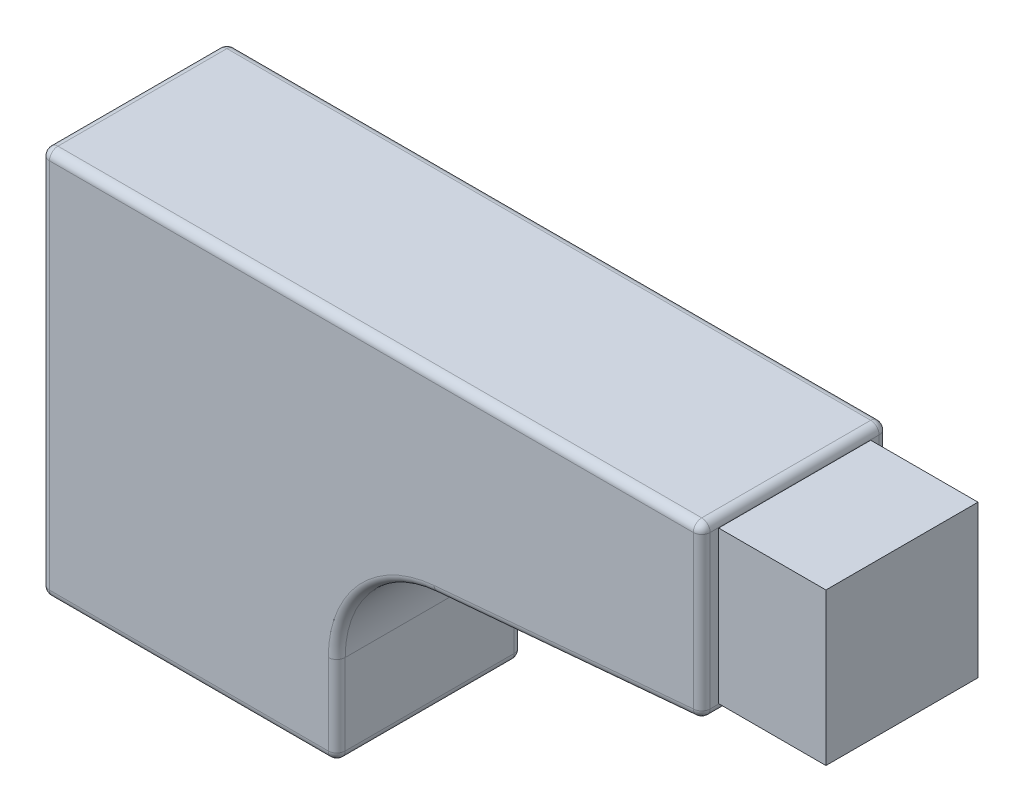
ISO-10303-21;
HEADER;
FILE_DESCRIPTION(('STEP AP214'),'2;1');
FILE_NAME('part.step','',(''),(''),'','','');
FILE_SCHEMA(('AUTOMOTIVE_DESIGN { 1 0 10303 214 1 1 1 1 }'));
ENDSEC;
DATA;
#1=APPLICATION_CONTEXT('core data for automotive mechanical design processes');
#2=APPLICATION_PROTOCOL_DEFINITION('international standard','automotive_design',2000,#1);
#3=PRODUCT_CONTEXT('',#1,'mechanical');
#4=PRODUCT('Part','Part','',(#3));
#5=PRODUCT_RELATED_PRODUCT_CATEGORY('part','',(#4));
#6=PRODUCT_DEFINITION_FORMATION('','',#4);
#7=PRODUCT_DEFINITION_CONTEXT('part definition',#1,'design');
#8=PRODUCT_DEFINITION('design','',#6,#7);
#9=PRODUCT_DEFINITION_SHAPE('','',#8);
#10=(LENGTH_UNIT() NAMED_UNIT(*) SI_UNIT(.MILLI.,.METRE.));
#11=(NAMED_UNIT(*) PLANE_ANGLE_UNIT() SI_UNIT($,.RADIAN.));
#12=(NAMED_UNIT(*) SI_UNIT($,.STERADIAN.) SOLID_ANGLE_UNIT());
#13=UNCERTAINTY_MEASURE_WITH_UNIT(LENGTH_MEASURE(1.E-05),#10,'distance_accuracy_value','');
#14=(GEOMETRIC_REPRESENTATION_CONTEXT(3) GLOBAL_UNCERTAINTY_ASSIGNED_CONTEXT((#13)) GLOBAL_UNIT_ASSIGNED_CONTEXT((#10,
#11,#12)) REPRESENTATION_CONTEXT('',''));
#15=CARTESIAN_POINT('',(0.,0.,0.));
#16=DIRECTION('',(0.,0.,1.));
#17=DIRECTION('',(1.,0.,0.));
#18=AXIS2_PLACEMENT_3D('',#15,#16,#17);
#19=CARTESIAN_POINT('',(19.55,11.5,5.5));
#20=DIRECTION('',(-1.,0.,0.));
#21=DIRECTION('',(0.,-1.,0.));
#22=AXIS2_PLACEMENT_3D('',#19,#20,#21);
#23=PLANE('',#22);
#24=DIRECTION('',(0.,0.,1.));
#25=VECTOR('',#24,1.);
#26=CARTESIAN_POINT('',(19.55,1.95816558700871,5.5));
#27=LINE('',#26,#25);
#28=CARTESIAN_POINT('',(19.55,1.95816558700871,5.));
#29=VERTEX_POINT('',#28);
#30=CARTESIAN_POINT('',(19.55,1.95816558700871,-5.));
#31=VERTEX_POINT('',#30);
#32=EDGE_CURVE('E295',#29,#31,#27,.F.);
#33=ORIENTED_EDGE('',*,*,#32,.T.);
#34=DIRECTION('',(0.,1.,0.));
#35=VECTOR('',#34,1.);
#36=CARTESIAN_POINT('',(19.55,11.5,-5.));
#37=LINE('',#36,#35);
#38=CARTESIAN_POINT('',(19.55,11.,-5.));
#39=VERTEX_POINT('',#38);
#40=EDGE_CURVE('E298',#31,#39,#37,.T.);
#41=ORIENTED_EDGE('',*,*,#40,.T.);
#42=DIRECTION('',(0.,0.,-1.));
#43=VECTOR('',#42,1.);
#44=CARTESIAN_POINT('',(19.55,11.,5.5));
#45=LINE('',#44,#43);
#46=CARTESIAN_POINT('',(19.55,11.,5.));
#47=VERTEX_POINT('',#46);
#48=EDGE_CURVE('E293',#39,#47,#45,.F.);
#49=ORIENTED_EDGE('',*,*,#48,.T.);
#50=DIRECTION('',(0.,1.,0.));
#51=VECTOR('',#50,1.);
#52=CARTESIAN_POINT('',(19.55,1.5,5.));
#53=LINE('',#52,#51);
#54=EDGE_CURVE('E291',#47,#29,#53,.F.);
#55=ORIENTED_EDGE('',*,*,#54,.T.);
#56=EDGE_LOOP('',(#33,#41,#49,#55));
#57=FACE_BOUND('',#56,.T.);
#58=DIRECTION('',(0.,1.,0.));
#59=VECTOR('',#58,1.);
#60=CARTESIAN_POINT('',(19.55,10.9790827935044,-4.5));
#61=LINE('',#60,#59);
#62=CARTESIAN_POINT('',(19.55,1.97908279350436,-4.5));
#63=VERTEX_POINT('',#62);
#64=CARTESIAN_POINT('',(19.55,10.9790827935044,-4.5));
#65=VERTEX_POINT('',#64);
#66=EDGE_CURVE('E211',#63,#65,#61,.T.);
#67=ORIENTED_EDGE('',*,*,#66,.F.);
#68=DIRECTION('',(0.,0.,-1.));
#69=VECTOR('',#68,1.);
#70=CARTESIAN_POINT('',(19.55,1.97908279350436,4.5));
#71=LINE('',#70,#69);
#72=CARTESIAN_POINT('',(19.55,1.97908279350436,4.5));
#73=VERTEX_POINT('',#72);
#74=EDGE_CURVE('E208',#73,#63,#71,.T.);
#75=ORIENTED_EDGE('',*,*,#74,.F.);
#76=DIRECTION('',(0.,-1.,0.));
#77=VECTOR('',#76,1.);
#78=CARTESIAN_POINT('',(19.55,10.9790827935044,4.5));
#79=LINE('',#78,#77);
#80=CARTESIAN_POINT('',(19.55,10.9790827935044,4.5));
#81=VERTEX_POINT('',#80);
#82=EDGE_CURVE('E56',#81,#73,#79,.T.);
#83=ORIENTED_EDGE('',*,*,#82,.F.);
#84=DIRECTION('',(0.,0.,1.));
#85=VECTOR('',#84,1.);
#86=CARTESIAN_POINT('',(19.55,10.9790827935044,4.5));
#87=LINE('',#86,#85);
#88=EDGE_CURVE('E51',#65,#81,#87,.T.);
#89=ORIENTED_EDGE('',*,*,#88,.F.);
#90=EDGE_LOOP('',(#67,#75,#83,#89));
#91=FACE_BOUND('',#90,.T.);
#92=ADVANCED_FACE('F34',(#57,#91),#23,.F.);
#93=CARTESIAN_POINT('',(-19.55,11.5,5.5));
#94=DIRECTION('',(1.,0.,0.));
#95=DIRECTION('',(0.,1.,0.));
#96=AXIS2_PLACEMENT_3D('',#93,#94,#95);
#97=PLANE('',#96);
#98=DIRECTION('',(0.,0.,-1.));
#99=VECTOR('',#98,1.);
#100=CARTESIAN_POINT('',(-19.55,11.,5.5));
#101=LINE('',#100,#99);
#102=CARTESIAN_POINT('',(-19.55,11.,5.));
#103=VERTEX_POINT('',#102);
#104=CARTESIAN_POINT('',(-19.55,11.,-5.));
#105=VERTEX_POINT('',#104);
#106=EDGE_CURVE('E278',#103,#105,#101,.T.);
#107=ORIENTED_EDGE('',*,*,#106,.T.);
#108=DIRECTION('',(0.,-1.,0.));
#109=VECTOR('',#108,1.);
#110=CARTESIAN_POINT('',(-19.55,11.5,-5.));
#111=LINE('',#110,#109);
#112=CARTESIAN_POINT('',(-19.55,-11.,-5.));
#113=VERTEX_POINT('',#112);
#114=EDGE_CURVE('E283',#105,#113,#111,.T.);
#115=ORIENTED_EDGE('',*,*,#114,.T.);
#116=DIRECTION('',(0.,0.,-1.));
#117=VECTOR('',#116,1.);
#118=CARTESIAN_POINT('',(-19.55,-11.,5.5));
#119=LINE('',#118,#117);
#120=CARTESIAN_POINT('',(-19.55,-11.,5.));
#121=VERTEX_POINT('',#120);
#122=EDGE_CURVE('E280',#113,#121,#119,.F.);
#123=ORIENTED_EDGE('',*,*,#122,.T.);
#124=DIRECTION('',(0.,-1.,0.));
#125=VECTOR('',#124,1.);
#126=CARTESIAN_POINT('',(-19.55,11.5,5.));
#127=LINE('',#126,#125);
#128=EDGE_CURVE('E276',#121,#103,#127,.F.);
#129=ORIENTED_EDGE('',*,*,#128,.T.);
#130=EDGE_LOOP('',(#107,#115,#123,#129));
#131=FACE_BOUND('',#130,.T.);
#132=ADVANCED_FACE('F512',(#131),#97,.F.);
#133=CARTESIAN_POINT('',(-19.55,-11.5,5.5));
#134=DIRECTION('',(0.,1.,0.));
#135=DIRECTION('',(0.,0.,1.));
#136=AXIS2_PLACEMENT_3D('',#133,#134,#135);
#137=PLANE('',#136);
#138=DIRECTION('',(0.,0.,-1.));
#139=VECTOR('',#138,1.);
#140=CARTESIAN_POINT('',(-19.05,-11.5,5.5));
#141=LINE('',#140,#139);
#142=CARTESIAN_POINT('',(-19.05,-11.5,5.));
#143=VERTEX_POINT('',#142);
#144=CARTESIAN_POINT('',(-19.05,-11.5,-5.));
#145=VERTEX_POINT('',#144);
#146=EDGE_CURVE('E269',#143,#145,#141,.T.);
#147=ORIENTED_EDGE('',*,*,#146,.T.);
#148=DIRECTION('',(1.,0.,0.));
#149=VECTOR('',#148,1.);
#150=CARTESIAN_POINT('',(-19.55,-11.5,-5.));
#151=LINE('',#150,#149);
#152=CARTESIAN_POINT('',(-2.55,-11.5,-5.));
#153=VERTEX_POINT('',#152);
#154=EDGE_CURVE('E273',#145,#153,#151,.T.);
#155=ORIENTED_EDGE('',*,*,#154,.T.);
#156=DIRECTION('',(0.,0.,1.));
#157=VECTOR('',#156,1.);
#158=CARTESIAN_POINT('',(-2.55,-11.5,5.5));
#159=LINE('',#158,#157);
#160=CARTESIAN_POINT('',(-2.55,-11.5,5.));
#161=VERTEX_POINT('',#160);
#162=EDGE_CURVE('E271',#153,#161,#159,.T.);
#163=ORIENTED_EDGE('',*,*,#162,.T.);
#164=DIRECTION('',(1.,0.,0.));
#165=VECTOR('',#164,1.);
#166=CARTESIAN_POINT('',(-19.55,-11.5,5.));
#167=LINE('',#166,#165);
#168=EDGE_CURVE('E267',#161,#143,#167,.F.);
#169=ORIENTED_EDGE('',*,*,#168,.T.);
#170=EDGE_LOOP('',(#147,#155,#163,#169));
#171=FACE_BOUND('',#170,.T.);
#172=ADVANCED_FACE('F525',(#171),#137,.F.);
#173=CARTESIAN_POINT('',(-19.55,11.5,5.5));
#174=DIRECTION('',(0.,-1.,0.));
#175=DIRECTION('',(0.,0.,-1.));
#176=AXIS2_PLACEMENT_3D('',#173,#174,#175);
#177=PLANE('',#176);
#178=DIRECTION('',(-1.,0.,0.));
#179=VECTOR('',#178,1.);
#180=CARTESIAN_POINT('',(19.55,11.5,5.));
#181=LINE('',#180,#179);
#182=CARTESIAN_POINT('',(-19.05,11.5,5.));
#183=VERTEX_POINT('',#182);
#184=CARTESIAN_POINT('',(19.05,11.5,5.));
#185=VERTEX_POINT('',#184);
#186=EDGE_CURVE('E300',#183,#185,#181,.F.);
#187=ORIENTED_EDGE('',*,*,#186,.T.);
#188=DIRECTION('',(0.,0.,-1.));
#189=VECTOR('',#188,1.);
#190=CARTESIAN_POINT('',(19.05,11.5,5.5));
#191=LINE('',#190,#189);
#192=CARTESIAN_POINT('',(19.05,11.5,-5.));
#193=VERTEX_POINT('',#192);
#194=EDGE_CURVE('E11',#185,#193,#191,.T.);
#195=ORIENTED_EDGE('',*,*,#194,.T.);
#196=DIRECTION('',(-1.,0.,0.));
#197=VECTOR('',#196,1.);
#198=CARTESIAN_POINT('',(-19.55,11.5,-5.));
#199=LINE('',#198,#197);
#200=CARTESIAN_POINT('',(-19.05,11.5,-5.));
#201=VERTEX_POINT('',#200);
#202=EDGE_CURVE('E43',#193,#201,#199,.T.);
#203=ORIENTED_EDGE('',*,*,#202,.T.);
#204=DIRECTION('',(0.,0.,-1.));
#205=VECTOR('',#204,1.);
#206=CARTESIAN_POINT('',(-19.05,11.5,5.5));
#207=LINE('',#206,#205);
#208=EDGE_CURVE('E302',#201,#183,#207,.F.);
#209=ORIENTED_EDGE('',*,*,#208,.T.);
#210=EDGE_LOOP('',(#187,#195,#203,#209));
#211=FACE_BOUND('',#210,.T.);
#212=ADVANCED_FACE('F422',(#211),#177,.F.);
#213=CARTESIAN_POINT('',(0.,0.,5.5));
#214=DIRECTION('',(0.,0.,1.));
#215=DIRECTION('',(1.,0.,0.));
#216=AXIS2_PLACEMENT_3D('',#213,#214,#215);
#217=PLANE('',#216);
#218=DIRECTION('',(0.,-1.,0.));
#219=VECTOR('',#218,1.);
#220=CARTESIAN_POINT('',(-2.55,-6.2084580871706,5.5));
#221=LINE('',#220,#219);
#222=CARTESIAN_POINT('',(-2.55,-11.,5.5));
#223=VERTEX_POINT('',#222);
#224=CARTESIAN_POINT('',(-2.55,-6.2084580871706,5.5));
#225=VERTEX_POINT('',#224);
#226=EDGE_CURVE('E258',#223,#225,#221,.F.);
#227=ORIENTED_EDGE('',*,*,#226,.T.);
#228=CARTESIAN_POINT('',(4.3,-6.2084580871706,5.5));
#229=DIRECTION('',(0.,0.,1.));
#230=DIRECTION('',(1.,0.,0.));
#231=AXIS2_PLACEMENT_3D('',#228,#229,#230);
#232=CIRCLE('',#231,6.85);
#233=CARTESIAN_POINT('',(3.70298316217854,0.615475594757854,5.5));
#234=VERTEX_POINT('',#233);
#235=EDGE_CURVE('E265',#225,#234,#232,.F.);
#236=ORIENTED_EDGE('',*,*,#235,.T.);
#237=DIRECTION('',(-0.996194698091746,-0.0871557427476584,0.));
#238=VECTOR('',#237,1.);
#239=CARTESIAN_POINT('',(19.5064221286262,1.99809734904587,5.5));
#240=LINE('',#239,#238);
#241=CARTESIAN_POINT('',(19.05,1.95816558700871,5.5));
#242=VERTEX_POINT('',#241);
#243=EDGE_CURVE('E263',#234,#242,#240,.F.);
#244=ORIENTED_EDGE('',*,*,#243,.T.);
#245=DIRECTION('',(0.,1.,0.));
#246=VECTOR('',#245,1.);
#247=CARTESIAN_POINT('',(19.05,11.5,5.5));
#248=LINE('',#247,#246);
#249=CARTESIAN_POINT('',(19.05,11.,5.5));
#250=VERTEX_POINT('',#249);
#251=EDGE_CURVE('E261',#242,#250,#248,.T.);
#252=ORIENTED_EDGE('',*,*,#251,.T.);
#253=DIRECTION('',(-1.,0.,0.));
#254=VECTOR('',#253,1.);
#255=CARTESIAN_POINT('',(-19.55,11.,5.5));
#256=LINE('',#255,#254);
#257=CARTESIAN_POINT('',(-19.05,11.,5.5));
#258=VERTEX_POINT('',#257);
#259=EDGE_CURVE('E254',#250,#258,#256,.T.);
#260=ORIENTED_EDGE('',*,*,#259,.T.);
#261=DIRECTION('',(0.,-1.,0.));
#262=VECTOR('',#261,1.);
#263=CARTESIAN_POINT('',(-19.05,-11.5,5.5));
#264=LINE('',#263,#262);
#265=CARTESIAN_POINT('',(-19.05,-11.,5.5));
#266=VERTEX_POINT('',#265);
#267=EDGE_CURVE('E252',#258,#266,#264,.T.);
#268=ORIENTED_EDGE('',*,*,#267,.T.);
#269=DIRECTION('',(1.,0.,0.));
#270=VECTOR('',#269,1.);
#271=CARTESIAN_POINT('',(-2.05,-11.,5.5));
#272=LINE('',#271,#270);
#273=EDGE_CURVE('E256',#266,#223,#272,.T.);
#274=ORIENTED_EDGE('',*,*,#273,.T.);
#275=EDGE_LOOP('',(#227,#236,#244,#252,#260,#268,#274));
#276=FACE_BOUND('',#275,.T.);
#277=ADVANCED_FACE('F433',(#276),#217,.T.);
#278=CARTESIAN_POINT('',(0.,0.,-5.5));
#279=DIRECTION('',(0.,0.,1.));
#280=DIRECTION('',(1.,0.,0.));
#281=AXIS2_PLACEMENT_3D('',#278,#279,#280);
#282=PLANE('',#281);
#283=DIRECTION('',(-0.996194698091746,-0.0871557427476584,0.));
#284=VECTOR('',#283,1.);
#285=CARTESIAN_POINT('',(-0.0253097903183602,0.289292227110779,-5.5));
#286=LINE('',#285,#284);
#287=CARTESIAN_POINT('',(19.05,1.95816558700871,-5.5));
#288=VERTEX_POINT('',#287);
#289=CARTESIAN_POINT('',(3.70298316217854,0.615475594757854,-5.5));
#290=VERTEX_POINT('',#289);
#291=EDGE_CURVE('E237',#288,#290,#286,.T.);
#292=ORIENTED_EDGE('',*,*,#291,.T.);
#293=CARTESIAN_POINT('',(4.3,-6.2084580871706,-5.5));
#294=DIRECTION('',(0.,0.,1.));
#295=DIRECTION('',(1.,0.,0.));
#296=AXIS2_PLACEMENT_3D('',#293,#294,#295);
#297=CIRCLE('',#296,6.85);
#298=CARTESIAN_POINT('',(-2.55,-6.2084580871706,-5.5));
#299=VERTEX_POINT('',#298);
#300=EDGE_CURVE('E239',#290,#299,#297,.T.);
#301=ORIENTED_EDGE('',*,*,#300,.T.);
#302=DIRECTION('',(0.,-1.,0.));
#303=VECTOR('',#302,1.);
#304=CARTESIAN_POINT('',(-2.55,0.,-5.5));
#305=LINE('',#304,#303);
#306=CARTESIAN_POINT('',(-2.55,-11.,-5.5));
#307=VERTEX_POINT('',#306);
#308=EDGE_CURVE('E232',#299,#307,#305,.T.);
#309=ORIENTED_EDGE('',*,*,#308,.T.);
#310=DIRECTION('',(1.,0.,0.));
#311=VECTOR('',#310,1.);
#312=CARTESIAN_POINT('',(0.,-11.,-5.5));
#313=LINE('',#312,#311);
#314=CARTESIAN_POINT('',(-19.05,-11.,-5.5));
#315=VERTEX_POINT('',#314);
#316=EDGE_CURVE('E230',#307,#315,#313,.F.);
#317=ORIENTED_EDGE('',*,*,#316,.T.);
#318=DIRECTION('',(0.,-1.,0.));
#319=VECTOR('',#318,1.);
#320=CARTESIAN_POINT('',(-19.05,0.,-5.5));
#321=LINE('',#320,#319);
#322=CARTESIAN_POINT('',(-19.05,11.,-5.5));
#323=VERTEX_POINT('',#322);
#324=EDGE_CURVE('E226',#315,#323,#321,.F.);
#325=ORIENTED_EDGE('',*,*,#324,.T.);
#326=DIRECTION('',(-1.,0.,0.));
#327=VECTOR('',#326,1.);
#328=CARTESIAN_POINT('',(0.,11.,-5.5));
#329=LINE('',#328,#327);
#330=CARTESIAN_POINT('',(19.05,11.,-5.5));
#331=VERTEX_POINT('',#330);
#332=EDGE_CURVE('E228',#323,#331,#329,.F.);
#333=ORIENTED_EDGE('',*,*,#332,.T.);
#334=DIRECTION('',(0.,1.,0.));
#335=VECTOR('',#334,1.);
#336=CARTESIAN_POINT('',(19.05,0.,-5.5));
#337=LINE('',#336,#335);
#338=EDGE_CURVE('E235',#331,#288,#337,.F.);
#339=ORIENTED_EDGE('',*,*,#338,.T.);
#340=EDGE_LOOP('',(#292,#301,#309,#317,#325,#333,#339));
#341=FACE_BOUND('',#340,.T.);
#342=ADVANCED_FACE('F474',(#341),#282,.F.);
#343=CARTESIAN_POINT('',(-2.05,-11.5,-5.5));
#344=DIRECTION('',(-1.,0.,0.));
#345=DIRECTION('',(0.,-1.,0.));
#346=AXIS2_PLACEMENT_3D('',#343,#344,#345);
#347=PLANE('',#346);
#348=DIRECTION('',(0.,0.,1.));
#349=VECTOR('',#348,1.);
#350=CARTESIAN_POINT('',(-2.05,-11.,-5.5));
#351=LINE('',#350,#349);
#352=CARTESIAN_POINT('',(-2.05,-11.,5.));
#353=VERTEX_POINT('',#352);
#354=CARTESIAN_POINT('',(-2.05,-11.,-5.));
#355=VERTEX_POINT('',#354);
#356=EDGE_CURVE('E241',#353,#355,#351,.F.);
#357=ORIENTED_EDGE('',*,*,#356,.T.);
#358=DIRECTION('',(0.,-1.,0.));
#359=VECTOR('',#358,1.);
#360=CARTESIAN_POINT('',(-2.05,-11.5,-5.));
#361=LINE('',#360,#359);
#362=CARTESIAN_POINT('',(-2.05,-6.2084580871706,-5.));
#363=VERTEX_POINT('',#362);
#364=EDGE_CURVE('E245',#355,#363,#361,.F.);
#365=ORIENTED_EDGE('',*,*,#364,.T.);
#366=DIRECTION('',(0.,0.,1.));
#367=VECTOR('',#366,1.);
#368=CARTESIAN_POINT('',(-2.05,-6.2084580871706,5.5));
#369=LINE('',#368,#367);
#370=CARTESIAN_POINT('',(-2.05,-6.2084580871706,5.));
#371=VERTEX_POINT('',#370);
#372=EDGE_CURVE('E220',#363,#371,#369,.T.);
#373=ORIENTED_EDGE('',*,*,#372,.T.);
#374=DIRECTION('',(0.,-1.,0.));
#375=VECTOR('',#374,1.);
#376=CARTESIAN_POINT('',(-2.05,-11.5,5.));
#377=LINE('',#376,#375);
#378=EDGE_CURVE('E243',#371,#353,#377,.T.);
#379=ORIENTED_EDGE('',*,*,#378,.T.);
#380=EDGE_LOOP('',(#357,#365,#373,#379));
#381=FACE_BOUND('',#380,.T.);
#382=ADVANCED_FACE('F452',(#381),#347,.F.);
#383=CARTESIAN_POINT('',(19.55,1.5,-5.5));
#384=DIRECTION('',(-0.0871557427476584,0.996194698091746,0.));
#385=DIRECTION('',(-0.996194698091746,-0.0871557427476584,0.));
#386=AXIS2_PLACEMENT_3D('',#383,#384,#385);
#387=PLANE('',#386);
#388=DIRECTION('',(0.,0.,1.));
#389=VECTOR('',#388,1.);
#390=CARTESIAN_POINT('',(3.74656103355237,0.117378245711981,-5.5));
#391=LINE('',#390,#389);
#392=CARTESIAN_POINT('',(3.74656103355237,0.117378245711981,5.));
#393=VERTEX_POINT('',#392);
#394=CARTESIAN_POINT('',(3.74656103355237,0.117378245711981,-5.));
#395=VERTEX_POINT('',#394);
#396=EDGE_CURVE('E223',#393,#395,#391,.F.);
#397=ORIENTED_EDGE('',*,*,#396,.T.);
#398=DIRECTION('',(-0.996194698091746,-0.0871557427476584,0.));
#399=VECTOR('',#398,1.);
#400=CARTESIAN_POINT('',(19.55,1.5,-5.));
#401=LINE('',#400,#399);
#402=CARTESIAN_POINT('',(19.0935778713738,1.46006823796284,-5.));
#403=VERTEX_POINT('',#402);
#404=EDGE_CURVE('E289',#395,#403,#401,.F.);
#405=ORIENTED_EDGE('',*,*,#404,.T.);
#406=DIRECTION('',(0.,0.,1.));
#407=VECTOR('',#406,1.);
#408=CARTESIAN_POINT('',(19.0935778713738,1.46006823796284,-5.5));
#409=LINE('',#408,#407);
#410=CARTESIAN_POINT('',(19.0935778713738,1.46006823796284,5.));
#411=VERTEX_POINT('',#410);
#412=EDGE_CURVE('E285',#403,#411,#409,.T.);
#413=ORIENTED_EDGE('',*,*,#412,.T.);
#414=DIRECTION('',(-0.996194698091746,-0.0871557427476584,0.));
#415=VECTOR('',#414,1.);
#416=CARTESIAN_POINT('',(3.74656103355236,0.117378245711981,5.));
#417=LINE('',#416,#415);
#418=EDGE_CURVE('E287',#411,#393,#417,.T.);
#419=ORIENTED_EDGE('',*,*,#418,.T.);
#420=EDGE_LOOP('',(#397,#405,#413,#419));
#421=FACE_BOUND('',#420,.T.);
#422=ADVANCED_FACE('F482',(#421),#387,.F.);
#423=CARTESIAN_POINT('',(4.3,-6.2084580871706,-5.5));
#424=DIRECTION('',(0.,0.,-1.));
#425=DIRECTION('',(-1.,0.,0.));
#426=AXIS2_PLACEMENT_3D('',#423,#424,#425);
#427=CYLINDRICAL_SURFACE('',#426,6.35);
#428=ORIENTED_EDGE('',*,*,#372,.F.);
#429=CARTESIAN_POINT('',(4.3,-6.2084580871706,-5.));
#430=DIRECTION('',(0.,0.,1.));
#431=DIRECTION('',(1.,0.,0.));
#432=AXIS2_PLACEMENT_3D('',#429,#430,#431);
#433=CIRCLE('',#432,6.35);
#434=EDGE_CURVE('E250',#363,#395,#433,.F.);
#435=ORIENTED_EDGE('',*,*,#434,.T.);
#436=ORIENTED_EDGE('',*,*,#396,.F.);
#437=CARTESIAN_POINT('',(4.3,-6.2084580871706,5.));
#438=DIRECTION('',(0.,0.,1.));
#439=DIRECTION('',(1.,0.,0.));
#440=AXIS2_PLACEMENT_3D('',#437,#438,#439);
#441=CIRCLE('',#440,6.35);
#442=EDGE_CURVE('E248',#393,#371,#441,.T.);
#443=ORIENTED_EDGE('',*,*,#442,.T.);
#444=EDGE_LOOP('',(#428,#435,#436,#443));
#445=FACE_BOUND('',#444,.T.);
#446=ADVANCED_FACE('F450',(#445),#427,.F.);
#447=CARTESIAN_POINT('',(0.,11.,5.));
#448=DIRECTION('',(1.,0.,0.));
#449=DIRECTION('',(0.,0.,-1.));
#450=AXIS2_PLACEMENT_3D('',#447,#448,#449);
#451=CYLINDRICAL_SURFACE('',#450,0.5);
#452=CARTESIAN_POINT('',(19.05,11.,5.));
#453=DIRECTION('',(1.,0.,0.));
#454=DIRECTION('',(0.,0.,-1.));
#455=AXIS2_PLACEMENT_3D('',#452,#453,#454);
#456=CIRCLE('',#455,0.5);
#457=EDGE_CURVE('E38',#185,#250,#456,.T.);
#458=ORIENTED_EDGE('',*,*,#457,.F.);
#459=ORIENTED_EDGE('',*,*,#186,.F.);
#460=CARTESIAN_POINT('',(-19.05,11.,5.));
#461=DIRECTION('',(-1.,0.,0.));
#462=DIRECTION('',(0.,-1.,0.));
#463=AXIS2_PLACEMENT_3D('',#460,#461,#462);
#464=CIRCLE('',#463,0.5);
#465=EDGE_CURVE('E390',#258,#183,#464,.T.);
#466=ORIENTED_EDGE('',*,*,#465,.F.);
#467=ORIENTED_EDGE('',*,*,#259,.F.);
#468=EDGE_LOOP('',(#458,#459,#466,#467));
#469=FACE_BOUND('',#468,.T.);
#470=ADVANCED_FACE('F36',(#469),#451,.T.);
#471=CARTESIAN_POINT('',(19.05,11.,5.));
#472=DIRECTION('',(0.,0.,1.));
#473=DIRECTION('',(1.,0.,0.));
#474=AXIS2_PLACEMENT_3D('',#471,#472,#473);
#475=SPHERICAL_SURFACE('',#474,0.5);
#476=CARTESIAN_POINT('',(19.05,11.,5.));
#477=DIRECTION('',(0.,0.,1.));
#478=DIRECTION('',(1.,0.,0.));
#479=AXIS2_PLACEMENT_3D('',#476,#477,#478);
#480=CIRCLE('',#479,0.5);
#481=EDGE_CURVE('E385',#185,#47,#480,.F.);
#482=ORIENTED_EDGE('',*,*,#481,.F.);
#483=ORIENTED_EDGE('',*,*,#457,.T.);
#484=CARTESIAN_POINT('',(19.05,11.,5.));
#485=DIRECTION('',(0.,1.,0.));
#486=DIRECTION('',(0.,0.,1.));
#487=AXIS2_PLACEMENT_3D('',#484,#485,#486);
#488=CIRCLE('',#487,0.5);
#489=EDGE_CURVE('E388',#47,#250,#488,.F.);
#490=ORIENTED_EDGE('',*,*,#489,.F.);
#491=EDGE_LOOP('',(#482,#483,#490));
#492=FACE_BOUND('',#491,.T.);
#493=ADVANCED_FACE('F401',(#492),#475,.T.);
#494=CARTESIAN_POINT('',(-19.05,11.,5.));
#495=DIRECTION('',(0.,0.,1.));
#496=DIRECTION('',(1.,0.,0.));
#497=AXIS2_PLACEMENT_3D('',#494,#495,#496);
#498=SPHERICAL_SURFACE('',#497,0.5);
#499=CARTESIAN_POINT('',(-19.05,11.,5.));
#500=DIRECTION('',(0.,1.,0.));
#501=DIRECTION('',(0.,0.,1.));
#502=AXIS2_PLACEMENT_3D('',#499,#500,#501);
#503=CIRCLE('',#502,0.5);
#504=EDGE_CURVE('E379',#258,#103,#503,.F.);
#505=ORIENTED_EDGE('',*,*,#504,.F.);
#506=ORIENTED_EDGE('',*,*,#465,.T.);
#507=CARTESIAN_POINT('',(-19.05,11.,5.));
#508=DIRECTION('',(0.,0.,1.));
#509=DIRECTION('',(1.,0.,0.));
#510=AXIS2_PLACEMENT_3D('',#507,#508,#509);
#511=CIRCLE('',#510,0.5);
#512=EDGE_CURVE('E382',#103,#183,#511,.F.);
#513=ORIENTED_EDGE('',*,*,#512,.F.);
#514=EDGE_LOOP('',(#505,#506,#513));
#515=FACE_BOUND('',#514,.T.);
#516=ADVANCED_FACE('F425',(#515),#498,.T.);
#517=CARTESIAN_POINT('',(19.05,0.,5.));
#518=DIRECTION('',(0.,-1.,0.));
#519=DIRECTION('',(1.,0.,0.));
#520=AXIS2_PLACEMENT_3D('',#517,#518,#519);
#521=CYLINDRICAL_SURFACE('',#520,0.5);
#522=ORIENTED_EDGE('',*,*,#489,.T.);
#523=ORIENTED_EDGE('',*,*,#251,.F.);
#524=CARTESIAN_POINT('',(19.05,1.95816558700871,5.));
#525=DIRECTION('',(0.,-1.,0.));
#526=DIRECTION('',(0.,0.,-1.));
#527=AXIS2_PLACEMENT_3D('',#524,#525,#526);
#528=CIRCLE('',#527,0.5);
#529=EDGE_CURVE('E373',#29,#242,#528,.T.);
#530=ORIENTED_EDGE('',*,*,#529,.F.);
#531=ORIENTED_EDGE('',*,*,#54,.F.);
#532=EDGE_LOOP('',(#522,#523,#530,#531));
#533=FACE_BOUND('',#532,.T.);
#534=ADVANCED_FACE('F409',(#533),#521,.T.);
#535=CARTESIAN_POINT('',(19.05,11.,5.5));
#536=DIRECTION('',(0.,0.,-1.));
#537=DIRECTION('',(-1.,0.,0.));
#538=AXIS2_PLACEMENT_3D('',#535,#536,#537);
#539=CYLINDRICAL_SURFACE('',#538,0.5);
#540=ORIENTED_EDGE('',*,*,#481,.T.);
#541=ORIENTED_EDGE('',*,*,#48,.F.);
#542=CARTESIAN_POINT('',(19.05,11.,-5.));
#543=DIRECTION('',(0.,0.,-1.));
#544=DIRECTION('',(-1.,0.,0.));
#545=AXIS2_PLACEMENT_3D('',#542,#543,#544);
#546=CIRCLE('',#545,0.5);
#547=EDGE_CURVE('E370',#193,#39,#546,.T.);
#548=ORIENTED_EDGE('',*,*,#547,.F.);
#549=ORIENTED_EDGE('',*,*,#194,.F.);
#550=EDGE_LOOP('',(#540,#541,#548,#549));
#551=FACE_BOUND('',#550,.T.);
#552=ADVANCED_FACE('F419',(#551),#539,.T.);
#553=CARTESIAN_POINT('',(-19.55,11.,-5.));
#554=DIRECTION('',(-1.,0.,0.));
#555=DIRECTION('',(0.,0.,1.));
#556=AXIS2_PLACEMENT_3D('',#553,#554,#555);
#557=CYLINDRICAL_SURFACE('',#556,0.5);
#558=CARTESIAN_POINT('',(-19.05,11.,-5.));
#559=DIRECTION('',(-1.,0.,0.));
#560=DIRECTION('',(0.,0.,1.));
#561=AXIS2_PLACEMENT_3D('',#558,#559,#560);
#562=CIRCLE('',#561,0.5);
#563=EDGE_CURVE('E365',#201,#323,#562,.T.);
#564=ORIENTED_EDGE('',*,*,#563,.F.);
#565=ORIENTED_EDGE('',*,*,#202,.F.);
#566=CARTESIAN_POINT('',(19.05,11.,-5.));
#567=DIRECTION('',(1.,0.,0.));
#568=DIRECTION('',(0.,1.,0.));
#569=AXIS2_PLACEMENT_3D('',#566,#567,#568);
#570=CIRCLE('',#569,0.5);
#571=EDGE_CURVE('E368',#331,#193,#570,.T.);
#572=ORIENTED_EDGE('',*,*,#571,.F.);
#573=ORIENTED_EDGE('',*,*,#332,.F.);
#574=EDGE_LOOP('',(#564,#565,#572,#573));
#575=FACE_BOUND('',#574,.T.);
#576=ADVANCED_FACE('F503',(#575),#557,.T.);
#577=CARTESIAN_POINT('',(-19.05,11.,5.5));
#578=DIRECTION('',(0.,0.,-1.));
#579=DIRECTION('',(-1.,0.,0.));
#580=AXIS2_PLACEMENT_3D('',#577,#578,#579);
#581=CYLINDRICAL_SURFACE('',#580,0.5);
#582=ORIENTED_EDGE('',*,*,#512,.T.);
#583=ORIENTED_EDGE('',*,*,#208,.F.);
#584=CARTESIAN_POINT('',(-19.05,11.,-5.));
#585=DIRECTION('',(0.,0.,-1.));
#586=DIRECTION('',(-1.,0.,0.));
#587=AXIS2_PLACEMENT_3D('',#584,#585,#586);
#588=CIRCLE('',#587,0.5);
#589=EDGE_CURVE('E362',#105,#201,#588,.T.);
#590=ORIENTED_EDGE('',*,*,#589,.F.);
#591=ORIENTED_EDGE('',*,*,#106,.F.);
#592=EDGE_LOOP('',(#582,#583,#590,#591));
#593=FACE_BOUND('',#592,.T.);
#594=ADVANCED_FACE('F510',(#593),#581,.T.);
#595=CARTESIAN_POINT('',(-19.05,0.,5.));
#596=DIRECTION('',(0.,1.,0.));
#597=DIRECTION('',(-1.,0.,0.));
#598=AXIS2_PLACEMENT_3D('',#595,#596,#597);
#599=CYLINDRICAL_SURFACE('',#598,0.5);
#600=ORIENTED_EDGE('',*,*,#504,.T.);
#601=ORIENTED_EDGE('',*,*,#128,.F.);
#602=CARTESIAN_POINT('',(-19.05,-11.,5.));
#603=DIRECTION('',(0.,-1.,0.));
#604=DIRECTION('',(0.,0.,-1.));
#605=AXIS2_PLACEMENT_3D('',#602,#603,#604);
#606=CIRCLE('',#605,0.5);
#607=EDGE_CURVE('E359',#266,#121,#606,.T.);
#608=ORIENTED_EDGE('',*,*,#607,.F.);
#609=ORIENTED_EDGE('',*,*,#267,.F.);
#610=EDGE_LOOP('',(#600,#601,#608,#609));
#611=FACE_BOUND('',#610,.T.);
#612=ADVANCED_FACE('F430',(#611),#599,.T.);
#613=CARTESIAN_POINT('',(19.5064221286262,1.99809734904587,5.));
#614=DIRECTION('',(0.996194698091746,0.0871557427476584,0.));
#615=DIRECTION('',(-0.0871557427476584,0.996194698091746,0.));
#616=AXIS2_PLACEMENT_3D('',#613,#614,#615);
#617=CYLINDRICAL_SURFACE('',#616,0.5);
#618=CARTESIAN_POINT('',(19.05,1.95816558700871,5.));
#619=DIRECTION('',(0.996194698091745,0.0871557427476604,0.));
#620=DIRECTION('',(-0.0871557427476604,0.996194698091745,0.));
#621=AXIS2_PLACEMENT_3D('',#618,#619,#620);
#622=CIRCLE('',#621,0.5);
#623=EDGE_CURVE('E376',#242,#411,#622,.T.);
#624=ORIENTED_EDGE('',*,*,#623,.F.);
#625=ORIENTED_EDGE('',*,*,#243,.F.);
#626=CARTESIAN_POINT('',(3.70298316217854,0.615475594757854,5.));
#627=DIRECTION('',(-0.996194698091745,-0.0871557427476587,0.));
#628=DIRECTION('',(0.0871557427476587,-0.996194698091746,0.));
#629=AXIS2_PLACEMENT_3D('',#626,#627,#628);
#630=CIRCLE('',#629,0.5);
#631=EDGE_CURVE('E356',#393,#234,#630,.T.);
#632=ORIENTED_EDGE('',*,*,#631,.F.);
#633=ORIENTED_EDGE('',*,*,#418,.F.);
#634=EDGE_LOOP('',(#624,#625,#632,#633));
#635=FACE_BOUND('',#634,.T.);
#636=ADVANCED_FACE('F440',(#635),#617,.T.);
#637=CARTESIAN_POINT('',(19.05,1.95816558700871,5.));
#638=DIRECTION('',(0.,0.,1.));
#639=DIRECTION('',(1.,0.,0.));
#640=AXIS2_PLACEMENT_3D('',#637,#638,#639);
#641=SPHERICAL_SURFACE('',#640,0.5);
#642=ORIENTED_EDGE('',*,*,#529,.T.);
#643=ORIENTED_EDGE('',*,*,#623,.T.);
#644=CARTESIAN_POINT('',(19.05,1.95816558700871,5.));
#645=DIRECTION('',(0.,0.,1.));
#646=DIRECTION('',(1.,0.,0.));
#647=AXIS2_PLACEMENT_3D('',#644,#645,#646);
#648=CIRCLE('',#647,0.5);
#649=EDGE_CURVE('E353',#29,#411,#648,.F.);
#650=ORIENTED_EDGE('',*,*,#649,.F.);
#651=EDGE_LOOP('',(#642,#643,#650));
#652=FACE_BOUND('',#651,.T.);
#653=ADVANCED_FACE('F747',(#652),#641,.T.);
#654=CARTESIAN_POINT('',(19.05,11.,-5.));
#655=DIRECTION('',(0.,0.,1.));
#656=DIRECTION('',(1.,0.,0.));
#657=AXIS2_PLACEMENT_3D('',#654,#655,#656);
#658=SPHERICAL_SURFACE('',#657,0.5);
#659=ORIENTED_EDGE('',*,*,#571,.T.);
#660=ORIENTED_EDGE('',*,*,#547,.T.);
#661=CARTESIAN_POINT('',(19.05,11.,-5.));
#662=DIRECTION('',(0.,1.,0.));
#663=DIRECTION('',(0.,0.,1.));
#664=AXIS2_PLACEMENT_3D('',#661,#662,#663);
#665=CIRCLE('',#664,0.5);
#666=EDGE_CURVE('E350',#331,#39,#665,.F.);
#667=ORIENTED_EDGE('',*,*,#666,.F.);
#668=EDGE_LOOP('',(#659,#660,#667));
#669=FACE_BOUND('',#668,.T.);
#670=ADVANCED_FACE('F498',(#669),#658,.T.);
#671=CARTESIAN_POINT('',(-19.05,11.,-5.));
#672=DIRECTION('',(0.,0.,1.));
#673=DIRECTION('',(1.,0.,0.));
#674=AXIS2_PLACEMENT_3D('',#671,#672,#673);
#675=SPHERICAL_SURFACE('',#674,0.5);
#676=ORIENTED_EDGE('',*,*,#589,.T.);
#677=ORIENTED_EDGE('',*,*,#563,.T.);
#678=CARTESIAN_POINT('',(-19.05,11.,-5.));
#679=DIRECTION('',(0.,1.,0.));
#680=DIRECTION('',(0.,0.,1.));
#681=AXIS2_PLACEMENT_3D('',#678,#679,#680);
#682=CIRCLE('',#681,0.5);
#683=EDGE_CURVE('E347',#105,#323,#682,.F.);
#684=ORIENTED_EDGE('',*,*,#683,.F.);
#685=EDGE_LOOP('',(#676,#677,#684));
#686=FACE_BOUND('',#685,.T.);
#687=ADVANCED_FACE('F507',(#686),#675,.T.);
#688=CARTESIAN_POINT('',(-19.05,-11.,5.));
#689=DIRECTION('',(0.,0.,1.));
#690=DIRECTION('',(1.,0.,0.));
#691=AXIS2_PLACEMENT_3D('',#688,#689,#690);
#692=SPHERICAL_SURFACE('',#691,0.5);
#693=CARTESIAN_POINT('',(-19.05,-11.,5.));
#694=DIRECTION('',(-1.,0.,0.));
#695=DIRECTION('',(0.,0.,1.));
#696=AXIS2_PLACEMENT_3D('',#693,#694,#695);
#697=CIRCLE('',#696,0.5);
#698=EDGE_CURVE('E342',#266,#143,#697,.F.);
#699=ORIENTED_EDGE('',*,*,#698,.F.);
#700=ORIENTED_EDGE('',*,*,#607,.T.);
#701=CARTESIAN_POINT('',(-19.05,-11.,5.));
#702=DIRECTION('',(0.,0.,1.));
#703=DIRECTION('',(1.,0.,0.));
#704=AXIS2_PLACEMENT_3D('',#701,#702,#703);
#705=CIRCLE('',#704,0.5);
#706=EDGE_CURVE('E345',#143,#121,#705,.F.);
#707=ORIENTED_EDGE('',*,*,#706,.F.);
#708=EDGE_LOOP('',(#699,#700,#707));
#709=FACE_BOUND('',#708,.T.);
#710=ADVANCED_FACE('F531',(#709),#692,.T.);
#711=CARTESIAN_POINT('',(4.3,-6.2084580871706,5.));
#712=DIRECTION('',(0.,0.,1.));
#713=DIRECTION('',(1.,0.,0.));
#714=AXIS2_PLACEMENT_3D('',#711,#712,#713);
#715=TOROIDAL_SURFACE('',#714,6.85,0.5);
#716=ORIENTED_EDGE('',*,*,#631,.T.);
#717=ORIENTED_EDGE('',*,*,#235,.F.);
#718=CARTESIAN_POINT('',(-2.55,-6.2084580871706,5.));
#719=DIRECTION('',(0.,-1.,0.));
#720=DIRECTION('',(0.,0.,-1.));
#721=AXIS2_PLACEMENT_3D('',#718,#719,#720);
#722=CIRCLE('',#721,0.5);
#723=EDGE_CURVE('E340',#371,#225,#722,.T.);
#724=ORIENTED_EDGE('',*,*,#723,.F.);
#725=ORIENTED_EDGE('',*,*,#442,.F.);
#726=EDGE_LOOP('',(#716,#717,#724,#725));
#727=FACE_BOUND('',#726,.T.);
#728=ADVANCED_FACE('F444',(#727),#715,.T.);
#729=CARTESIAN_POINT('',(19.05,1.95816558700871,-5.5));
#730=DIRECTION('',(0.,0.,1.));
#731=DIRECTION('',(1.,0.,0.));
#732=AXIS2_PLACEMENT_3D('',#729,#730,#731);
#733=CYLINDRICAL_SURFACE('',#732,0.5);
#734=ORIENTED_EDGE('',*,*,#649,.T.);
#735=ORIENTED_EDGE('',*,*,#412,.F.);
#736=CARTESIAN_POINT('',(19.05,1.95816558700871,-5.));
#737=DIRECTION('',(0.,0.,-1.));
#738=DIRECTION('',(-1.,0.,0.));
#739=AXIS2_PLACEMENT_3D('',#736,#737,#738);
#740=CIRCLE('',#739,0.5);
#741=EDGE_CURVE('E337',#31,#403,#740,.T.);
#742=ORIENTED_EDGE('',*,*,#741,.F.);
#743=ORIENTED_EDGE('',*,*,#32,.F.);
#744=EDGE_LOOP('',(#734,#735,#742,#743));
#745=FACE_BOUND('',#744,.T.);
#746=ADVANCED_FACE('F492',(#745),#733,.T.);
#747=CARTESIAN_POINT('',(19.05,11.5,-5.));
#748=DIRECTION('',(0.,1.,0.));
#749=DIRECTION('',(-1.,0.,0.));
#750=AXIS2_PLACEMENT_3D('',#747,#748,#749);
#751=CYLINDRICAL_SURFACE('',#750,0.5);
#752=ORIENTED_EDGE('',*,*,#666,.T.);
#753=ORIENTED_EDGE('',*,*,#40,.F.);
#754=CARTESIAN_POINT('',(19.05,1.95816558700871,-5.));
#755=DIRECTION('',(0.,-1.,0.));
#756=DIRECTION('',(0.,0.,-1.));
#757=AXIS2_PLACEMENT_3D('',#754,#755,#756);
#758=CIRCLE('',#757,0.5);
#759=EDGE_CURVE('E335',#288,#31,#758,.T.);
#760=ORIENTED_EDGE('',*,*,#759,.F.);
#761=ORIENTED_EDGE('',*,*,#338,.F.);
#762=EDGE_LOOP('',(#752,#753,#760,#761));
#763=FACE_BOUND('',#762,.T.);
#764=ADVANCED_FACE('F494',(#763),#751,.T.);
#765=CARTESIAN_POINT('',(-19.05,11.5,-5.));
#766=DIRECTION('',(0.,-1.,0.));
#767=DIRECTION('',(1.,0.,0.));
#768=AXIS2_PLACEMENT_3D('',#765,#766,#767);
#769=CYLINDRICAL_SURFACE('',#768,0.5);
#770=ORIENTED_EDGE('',*,*,#683,.T.);
#771=ORIENTED_EDGE('',*,*,#324,.F.);
#772=CARTESIAN_POINT('',(-19.05,-11.,-5.));
#773=DIRECTION('',(0.,-1.,0.));
#774=DIRECTION('',(0.,0.,-1.));
#775=AXIS2_PLACEMENT_3D('',#772,#773,#774);
#776=CIRCLE('',#775,0.5);
#777=EDGE_CURVE('E332',#113,#315,#776,.T.);
#778=ORIENTED_EDGE('',*,*,#777,.F.);
#779=ORIENTED_EDGE('',*,*,#114,.F.);
#780=EDGE_LOOP('',(#770,#771,#778,#779));
#781=FACE_BOUND('',#780,.T.);
#782=ADVANCED_FACE('F521',(#781),#769,.T.);
#783=CARTESIAN_POINT('',(-19.05,-11.,5.5));
#784=DIRECTION('',(0.,0.,-1.));
#785=DIRECTION('',(-1.,0.,0.));
#786=AXIS2_PLACEMENT_3D('',#783,#784,#785);
#787=CYLINDRICAL_SURFACE('',#786,0.5);
#788=ORIENTED_EDGE('',*,*,#706,.T.);
#789=ORIENTED_EDGE('',*,*,#122,.F.);
#790=CARTESIAN_POINT('',(-19.05,-11.,-5.));
#791=DIRECTION('',(0.,0.,-1.));
#792=DIRECTION('',(-1.,0.,0.));
#793=AXIS2_PLACEMENT_3D('',#790,#791,#792);
#794=CIRCLE('',#793,0.5);
#795=EDGE_CURVE('E329',#145,#113,#794,.T.);
#796=ORIENTED_EDGE('',*,*,#795,.F.);
#797=ORIENTED_EDGE('',*,*,#146,.F.);
#798=EDGE_LOOP('',(#788,#789,#796,#797));
#799=FACE_BOUND('',#798,.T.);
#800=ADVANCED_FACE('F517',(#799),#787,.T.);
#801=CARTESIAN_POINT('',(0.,-11.,5.));
#802=DIRECTION('',(-1.,0.,0.));
#803=DIRECTION('',(0.,0.,1.));
#804=AXIS2_PLACEMENT_3D('',#801,#802,#803);
#805=CYLINDRICAL_SURFACE('',#804,0.5);
#806=ORIENTED_EDGE('',*,*,#698,.T.);
#807=ORIENTED_EDGE('',*,*,#168,.F.);
#808=CARTESIAN_POINT('',(-2.55,-11.,5.));
#809=DIRECTION('',(1.,0.,0.));
#810=DIRECTION('',(0.,1.,0.));
#811=AXIS2_PLACEMENT_3D('',#808,#809,#810);
#812=CIRCLE('',#811,0.5);
#813=EDGE_CURVE('E326',#223,#161,#812,.T.);
#814=ORIENTED_EDGE('',*,*,#813,.F.);
#815=ORIENTED_EDGE('',*,*,#273,.F.);
#816=EDGE_LOOP('',(#806,#807,#814,#815));
#817=FACE_BOUND('',#816,.T.);
#818=ADVANCED_FACE('F529',(#817),#805,.T.);
#819=CARTESIAN_POINT('',(-2.55,-11.5,5.));
#820=DIRECTION('',(0.,1.,0.));
#821=DIRECTION('',(-1.,0.,0.));
#822=AXIS2_PLACEMENT_3D('',#819,#820,#821);
#823=CYLINDRICAL_SURFACE('',#822,0.5);
#824=ORIENTED_EDGE('',*,*,#723,.T.);
#825=ORIENTED_EDGE('',*,*,#226,.F.);
#826=CARTESIAN_POINT('',(-2.55,-11.,5.));
#827=DIRECTION('',(0.,-1.,0.));
#828=DIRECTION('',(0.,0.,-1.));
#829=AXIS2_PLACEMENT_3D('',#826,#827,#828);
#830=CIRCLE('',#829,0.5);
#831=EDGE_CURVE('E323',#353,#223,#830,.T.);
#832=ORIENTED_EDGE('',*,*,#831,.F.);
#833=ORIENTED_EDGE('',*,*,#378,.F.);
#834=EDGE_LOOP('',(#824,#825,#832,#833));
#835=FACE_BOUND('',#834,.T.);
#836=ADVANCED_FACE('F575',(#835),#823,.T.);
#837=CARTESIAN_POINT('',(19.05,1.95816558700871,-5.));
#838=DIRECTION('',(0.,0.,1.));
#839=DIRECTION('',(1.,0.,0.));
#840=AXIS2_PLACEMENT_3D('',#837,#838,#839);
#841=SPHERICAL_SURFACE('',#840,0.5);
#842=ORIENTED_EDGE('',*,*,#759,.T.);
#843=ORIENTED_EDGE('',*,*,#741,.T.);
#844=CARTESIAN_POINT('',(19.05,1.95816558700871,-5.));
#845=DIRECTION('',(0.996194698091745,0.0871557427476604,0.));
#846=DIRECTION('',(-0.0871557427476604,0.996194698091745,0.));
#847=AXIS2_PLACEMENT_3D('',#844,#845,#846);
#848=CIRCLE('',#847,0.5);
#849=EDGE_CURVE('E320',#288,#403,#848,.F.);
#850=ORIENTED_EDGE('',*,*,#849,.F.);
#851=EDGE_LOOP('',(#842,#843,#850));
#852=FACE_BOUND('',#851,.T.);
#853=ADVANCED_FACE('F488',(#852),#841,.T.);
#854=CARTESIAN_POINT('',(-19.05,-11.,-5.));
#855=DIRECTION('',(0.,0.,1.));
#856=DIRECTION('',(1.,0.,0.));
#857=AXIS2_PLACEMENT_3D('',#854,#855,#856);
#858=SPHERICAL_SURFACE('',#857,0.5);
#859=ORIENTED_EDGE('',*,*,#795,.T.);
#860=ORIENTED_EDGE('',*,*,#777,.T.);
#861=CARTESIAN_POINT('',(-19.05,-11.,-5.));
#862=DIRECTION('',(-1.,0.,0.));
#863=DIRECTION('',(0.,0.,1.));
#864=AXIS2_PLACEMENT_3D('',#861,#862,#863);
#865=CIRCLE('',#864,0.5);
#866=EDGE_CURVE('E317',#145,#315,#865,.F.);
#867=ORIENTED_EDGE('',*,*,#866,.F.);
#868=EDGE_LOOP('',(#859,#860,#867));
#869=FACE_BOUND('',#868,.T.);
#870=ADVANCED_FACE('F523',(#869),#858,.T.);
#871=CARTESIAN_POINT('',(-2.55,-11.,5.));
#872=DIRECTION('',(0.,0.,1.));
#873=DIRECTION('',(1.,0.,0.));
#874=AXIS2_PLACEMENT_3D('',#871,#872,#873);
#875=SPHERICAL_SURFACE('',#874,0.5);
#876=ORIENTED_EDGE('',*,*,#831,.T.);
#877=ORIENTED_EDGE('',*,*,#813,.T.);
#878=CARTESIAN_POINT('',(-2.55,-11.,5.));
#879=DIRECTION('',(0.,0.,1.));
#880=DIRECTION('',(1.,0.,0.));
#881=AXIS2_PLACEMENT_3D('',#878,#879,#880);
#882=CIRCLE('',#881,0.5);
#883=EDGE_CURVE('E314',#353,#161,#882,.F.);
#884=ORIENTED_EDGE('',*,*,#883,.F.);
#885=EDGE_LOOP('',(#876,#877,#884));
#886=FACE_BOUND('',#885,.T.);
#887=ADVANCED_FACE('F567',(#886),#875,.T.);
#888=CARTESIAN_POINT('',(-0.0253097903183602,0.289292227110778,-5.));
#889=DIRECTION('',(-0.996194698091746,-0.0871557427476584,0.));
#890=DIRECTION('',(0.0871557427476584,-0.996194698091746,0.));
#891=AXIS2_PLACEMENT_3D('',#888,#889,#890);
#892=CYLINDRICAL_SURFACE('',#891,0.5);
#893=ORIENTED_EDGE('',*,*,#849,.T.);
#894=ORIENTED_EDGE('',*,*,#404,.F.);
#895=CARTESIAN_POINT('',(3.70298316217854,0.615475594757854,-5.));
#896=DIRECTION('',(-0.996194698091745,-0.0871557427476587,0.));
#897=DIRECTION('',(0.0871557427476587,-0.996194698091746,0.));
#898=AXIS2_PLACEMENT_3D('',#895,#896,#897);
#899=CIRCLE('',#898,0.5);
#900=EDGE_CURVE('E311',#290,#395,#899,.T.);
#901=ORIENTED_EDGE('',*,*,#900,.F.);
#902=ORIENTED_EDGE('',*,*,#291,.F.);
#903=EDGE_LOOP('',(#893,#894,#901,#902));
#904=FACE_BOUND('',#903,.T.);
#905=ADVANCED_FACE('F485',(#904),#892,.T.);
#906=CARTESIAN_POINT('',(-19.55,-11.,-5.));
#907=DIRECTION('',(1.,0.,0.));
#908=DIRECTION('',(0.,0.,-1.));
#909=AXIS2_PLACEMENT_3D('',#906,#907,#908);
#910=CYLINDRICAL_SURFACE('',#909,0.5);
#911=ORIENTED_EDGE('',*,*,#866,.T.);
#912=ORIENTED_EDGE('',*,*,#316,.F.);
#913=CARTESIAN_POINT('',(-2.55,-11.,-5.));
#914=DIRECTION('',(1.,0.,0.));
#915=DIRECTION('',(0.,0.,-1.));
#916=AXIS2_PLACEMENT_3D('',#913,#914,#915);
#917=CIRCLE('',#916,0.5);
#918=EDGE_CURVE('E308',#153,#307,#917,.T.);
#919=ORIENTED_EDGE('',*,*,#918,.F.);
#920=ORIENTED_EDGE('',*,*,#154,.F.);
#921=EDGE_LOOP('',(#911,#912,#919,#920));
#922=FACE_BOUND('',#921,.T.);
#923=ADVANCED_FACE('F470',(#922),#910,.T.);
#924=CARTESIAN_POINT('',(-2.55,-11.,5.5));
#925=DIRECTION('',(0.,0.,1.));
#926=DIRECTION('',(1.,0.,0.));
#927=AXIS2_PLACEMENT_3D('',#924,#925,#926);
#928=CYLINDRICAL_SURFACE('',#927,0.5);
#929=ORIENTED_EDGE('',*,*,#883,.T.);
#930=ORIENTED_EDGE('',*,*,#162,.F.);
#931=CARTESIAN_POINT('',(-2.55,-11.,-5.));
#932=DIRECTION('',(0.,0.,-1.));
#933=DIRECTION('',(-1.,0.,0.));
#934=AXIS2_PLACEMENT_3D('',#931,#932,#933);
#935=CIRCLE('',#934,0.5);
#936=EDGE_CURVE('E306',#355,#153,#935,.T.);
#937=ORIENTED_EDGE('',*,*,#936,.F.);
#938=ORIENTED_EDGE('',*,*,#356,.F.);
#939=EDGE_LOOP('',(#929,#930,#937,#938));
#940=FACE_BOUND('',#939,.T.);
#941=ADVANCED_FACE('F559',(#940),#928,.T.);
#942=CARTESIAN_POINT('',(4.3,-6.2084580871706,-5.));
#943=DIRECTION('',(0.,0.,1.));
#944=DIRECTION('',(1.,0.,0.));
#945=AXIS2_PLACEMENT_3D('',#942,#943,#944);
#946=TOROIDAL_SURFACE('',#945,6.85,0.5);
#947=ORIENTED_EDGE('',*,*,#900,.T.);
#948=ORIENTED_EDGE('',*,*,#434,.F.);
#949=CARTESIAN_POINT('',(-2.55,-6.2084580871706,-5.));
#950=DIRECTION('',(0.,-1.,0.));
#951=DIRECTION('',(0.,0.,-1.));
#952=AXIS2_PLACEMENT_3D('',#949,#950,#951);
#953=CIRCLE('',#952,0.5);
#954=EDGE_CURVE('E214',#299,#363,#953,.T.);
#955=ORIENTED_EDGE('',*,*,#954,.F.);
#956=ORIENTED_EDGE('',*,*,#300,.F.);
#957=EDGE_LOOP('',(#947,#948,#955,#956));
#958=FACE_BOUND('',#957,.T.);
#959=ADVANCED_FACE('F479',(#958),#946,.T.);
#960=CARTESIAN_POINT('',(-2.55,-11.,-5.));
#961=DIRECTION('',(0.,0.,1.));
#962=DIRECTION('',(1.,0.,0.));
#963=AXIS2_PLACEMENT_3D('',#960,#961,#962);
#964=SPHERICAL_SURFACE('',#963,0.5);
#965=ORIENTED_EDGE('',*,*,#936,.T.);
#966=ORIENTED_EDGE('',*,*,#918,.T.);
#967=CARTESIAN_POINT('',(-2.55,-11.,-5.));
#968=DIRECTION('',(0.,-1.,0.));
#969=DIRECTION('',(0.,0.,-1.));
#970=AXIS2_PLACEMENT_3D('',#967,#968,#969);
#971=CIRCLE('',#970,0.5);
#972=EDGE_CURVE('E212',#355,#307,#971,.F.);
#973=ORIENTED_EDGE('',*,*,#972,.F.);
#974=EDGE_LOOP('',(#965,#966,#973));
#975=FACE_BOUND('',#974,.T.);
#976=ADVANCED_FACE('F464',(#975),#964,.T.);
#977=CARTESIAN_POINT('',(-2.55,0.,-5.));
#978=DIRECTION('',(0.,-1.,0.));
#979=DIRECTION('',(1.,0.,0.));
#980=AXIS2_PLACEMENT_3D('',#977,#978,#979);
#981=CYLINDRICAL_SURFACE('',#980,0.5);
#982=ORIENTED_EDGE('',*,*,#954,.T.);
#983=ORIENTED_EDGE('',*,*,#364,.F.);
#984=ORIENTED_EDGE('',*,*,#972,.T.);
#985=ORIENTED_EDGE('',*,*,#308,.F.);
#986=EDGE_LOOP('',(#982,#983,#984,#985));
#987=FACE_BOUND('',#986,.T.);
#988=ADVANCED_FACE('F459',(#987),#981,.T.);
#989=CARTESIAN_POINT('',(25.9,10.9790827935044,-4.5));
#990=DIRECTION('',(0.,0.,1.));
#991=DIRECTION('',(1.,0.,0.));
#992=AXIS2_PLACEMENT_3D('',#989,#990,#991);
#993=PLANE('',#992);
#994=ORIENTED_EDGE('',*,*,#66,.T.);
#995=DIRECTION('',(-1.,0.,0.));
#996=VECTOR('',#995,1.);
#997=CARTESIAN_POINT('',(25.9,10.9790827935044,-4.5));
#998=LINE('',#997,#996);
#999=CARTESIAN_POINT('',(25.9,10.9790827935044,-4.5));
#1000=VERTEX_POINT('',#999);
#1001=EDGE_CURVE('E192',#1000,#65,#998,.T.);
#1002=ORIENTED_EDGE('',*,*,#1001,.F.);
#1003=DIRECTION('',(0.,1.,0.));
#1004=VECTOR('',#1003,1.);
#1005=CARTESIAN_POINT('',(25.9,10.9790827935044,-4.5));
#1006=LINE('',#1005,#1004);
#1007=CARTESIAN_POINT('',(25.9,1.97908279350436,-4.5));
#1008=VERTEX_POINT('',#1007);
#1009=EDGE_CURVE('E199',#1008,#1000,#1006,.T.);
#1010=ORIENTED_EDGE('',*,*,#1009,.F.);
#1011=DIRECTION('',(-1.,0.,0.));
#1012=VECTOR('',#1011,1.);
#1013=CARTESIAN_POINT('',(25.9,1.97908279350436,-4.5));
#1014=LINE('',#1013,#1012);
#1015=EDGE_CURVE('E888',#1008,#63,#1014,.T.);
#1016=ORIENTED_EDGE('',*,*,#1015,.T.);
#1017=EDGE_LOOP('',(#994,#1002,#1010,#1016));
#1018=FACE_BOUND('',#1017,.T.);
#1019=ADVANCED_FACE('F210',(#1018),#993,.F.);
#1020=CARTESIAN_POINT('',(25.9,10.9790827935044,4.5));
#1021=DIRECTION('',(0.,-1.,0.));
#1022=DIRECTION('',(1.,0.,0.));
#1023=AXIS2_PLACEMENT_3D('',#1020,#1021,#1022);
#1024=PLANE('',#1023);
#1025=ORIENTED_EDGE('',*,*,#88,.T.);
#1026=DIRECTION('',(-1.,0.,0.));
#1027=VECTOR('',#1026,1.);
#1028=CARTESIAN_POINT('',(25.9,10.9790827935044,4.5));
#1029=LINE('',#1028,#1027);
#1030=CARTESIAN_POINT('',(25.9,10.9790827935044,4.5));
#1031=VERTEX_POINT('',#1030);
#1032=EDGE_CURVE('E195',#1031,#81,#1029,.T.);
#1033=ORIENTED_EDGE('',*,*,#1032,.F.);
#1034=DIRECTION('',(0.,0.,1.));
#1035=VECTOR('',#1034,1.);
#1036=CARTESIAN_POINT('',(25.9,10.9790827935044,4.5));
#1037=LINE('',#1036,#1035);
#1038=EDGE_CURVE('E188',#1000,#1031,#1037,.T.);
#1039=ORIENTED_EDGE('',*,*,#1038,.F.);
#1040=ORIENTED_EDGE('',*,*,#1001,.T.);
#1041=EDGE_LOOP('',(#1025,#1033,#1039,#1040));
#1042=FACE_BOUND('',#1041,.T.);
#1043=ADVANCED_FACE('F190',(#1042),#1024,.F.);
#1044=CARTESIAN_POINT('',(25.9,10.9790827935044,4.5));
#1045=DIRECTION('',(0.,0.,-1.));
#1046=DIRECTION('',(0.,1.,0.));
#1047=AXIS2_PLACEMENT_3D('',#1044,#1045,#1046);
#1048=PLANE('',#1047);
#1049=ORIENTED_EDGE('',*,*,#82,.T.);
#1050=DIRECTION('',(-1.,0.,0.));
#1051=VECTOR('',#1050,1.);
#1052=CARTESIAN_POINT('',(25.9,1.97908279350436,4.5));
#1053=LINE('',#1052,#1051);
#1054=CARTESIAN_POINT('',(25.9,1.97908279350436,4.5));
#1055=VERTEX_POINT('',#1054);
#1056=EDGE_CURVE('E216',#1055,#73,#1053,.T.);
#1057=ORIENTED_EDGE('',*,*,#1056,.F.);
#1058=DIRECTION('',(0.,-1.,0.));
#1059=VECTOR('',#1058,1.);
#1060=CARTESIAN_POINT('',(25.9,10.9790827935044,4.5));
#1061=LINE('',#1060,#1059);
#1062=EDGE_CURVE('E198',#1031,#1055,#1061,.T.);
#1063=ORIENTED_EDGE('',*,*,#1062,.F.);
#1064=ORIENTED_EDGE('',*,*,#1032,.T.);
#1065=EDGE_LOOP('',(#1049,#1057,#1063,#1064));
#1066=FACE_BOUND('',#1065,.T.);
#1067=ADVANCED_FACE('F660',(#1066),#1048,.F.);
#1068=CARTESIAN_POINT('',(25.9,1.97908279350436,4.5));
#1069=DIRECTION('',(0.,1.,0.));
#1070=DIRECTION('',(-1.,0.,0.));
#1071=AXIS2_PLACEMENT_3D('',#1068,#1069,#1070);
#1072=PLANE('',#1071);
#1073=ORIENTED_EDGE('',*,*,#74,.T.);
#1074=ORIENTED_EDGE('',*,*,#1015,.F.);
#1075=DIRECTION('',(0.,0.,-1.));
#1076=VECTOR('',#1075,1.);
#1077=CARTESIAN_POINT('',(25.9,1.97908279350436,4.5));
#1078=LINE('',#1077,#1076);
#1079=EDGE_CURVE('E204',#1055,#1008,#1078,.T.);
#1080=ORIENTED_EDGE('',*,*,#1079,.F.);
#1081=ORIENTED_EDGE('',*,*,#1056,.T.);
#1082=EDGE_LOOP('',(#1073,#1074,#1080,#1081));
#1083=FACE_BOUND('',#1082,.T.);
#1084=ADVANCED_FACE('F667',(#1083),#1072,.F.);
#1085=CARTESIAN_POINT('',(25.9,0.,0.));
#1086=DIRECTION('',(1.,0.,0.));
#1087=DIRECTION('',(0.,0.,-1.));
#1088=AXIS2_PLACEMENT_3D('',#1085,#1086,#1087);
#1089=PLANE('',#1088);
#1090=ORIENTED_EDGE('',*,*,#1009,.T.);
#1091=ORIENTED_EDGE('',*,*,#1038,.T.);
#1092=ORIENTED_EDGE('',*,*,#1062,.T.);
#1093=ORIENTED_EDGE('',*,*,#1079,.T.);
#1094=EDGE_LOOP('',(#1090,#1091,#1092,#1093));
#1095=FACE_BOUND('',#1094,.T.);
#1096=ADVANCED_FACE('F202',(#1095),#1089,.T.);
#1097=CLOSED_SHELL('',(#92,#132,#172,#212,#277,#342,#382,#422,#446,#470,#493,#516,#534,#552,
#576,#594,#612,#636,#653,#670,#687,#710,#728,#746,#764,#782,#800,#818,#836,#853,#870,#887,#905,
#923,#941,#959,#976,#988,#1019,#1043,#1067,#1084,#1096));
#1098=MANIFOLD_SOLID_BREP('B2',#1097);
#1099=ADVANCED_BREP_SHAPE_REPRESENTATION('',(#18,#1098),#14);
#1100=SHAPE_DEFINITION_REPRESENTATION(#9,#1099);
ENDSEC;
END-ISO-10303-21;
